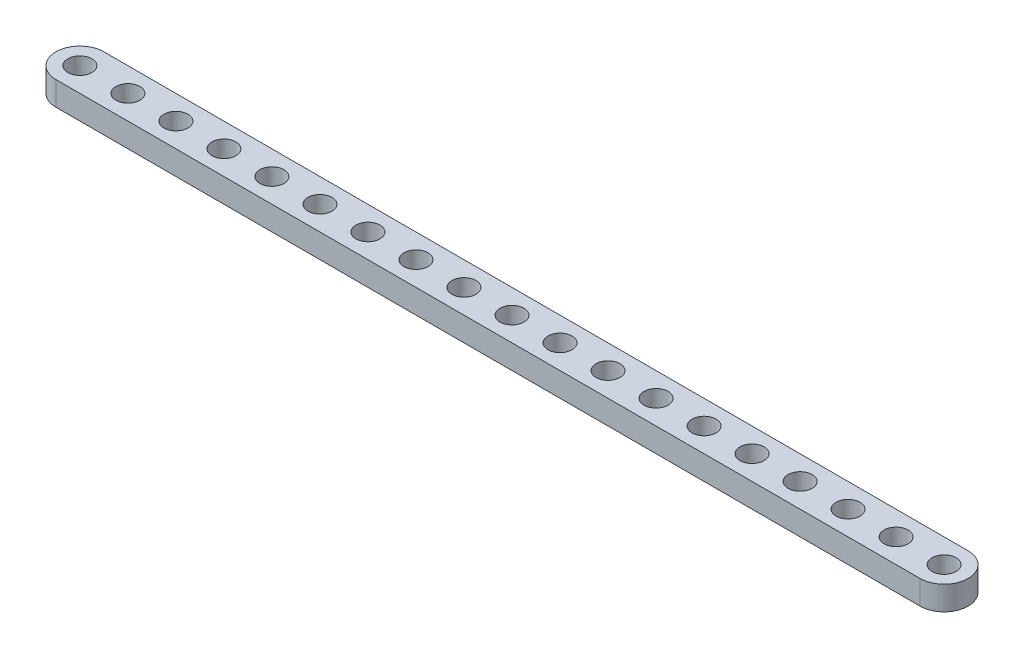
ISO-10303-21;
HEADER;
FILE_DESCRIPTION(('STEP AP214'),'2;1');
FILE_NAME('part.step','',(''),(''),'','','');
FILE_SCHEMA(('AUTOMOTIVE_DESIGN { 1 0 10303 214 1 1 1 1 }'));
ENDSEC;
DATA;
#1=APPLICATION_CONTEXT('core data for automotive mechanical design processes');
#2=APPLICATION_PROTOCOL_DEFINITION('international standard','automotive_design',2000,#1);
#3=PRODUCT_CONTEXT('',#1,'mechanical');
#4=PRODUCT('Part','Part','',(#3));
#5=PRODUCT_RELATED_PRODUCT_CATEGORY('part','',(#4));
#6=PRODUCT_DEFINITION_FORMATION('','',#4);
#7=PRODUCT_DEFINITION_CONTEXT('part definition',#1,'design');
#8=PRODUCT_DEFINITION('design','',#6,#7);
#9=PRODUCT_DEFINITION_SHAPE('','',#8);
#10=(LENGTH_UNIT() NAMED_UNIT(*) SI_UNIT(.MILLI.,.METRE.));
#11=(NAMED_UNIT(*) PLANE_ANGLE_UNIT() SI_UNIT($,.RADIAN.));
#12=(NAMED_UNIT(*) SI_UNIT($,.STERADIAN.) SOLID_ANGLE_UNIT());
#13=UNCERTAINTY_MEASURE_WITH_UNIT(LENGTH_MEASURE(1.E-05),#10,'distance_accuracy_value','');
#14=(GEOMETRIC_REPRESENTATION_CONTEXT(3) GLOBAL_UNCERTAINTY_ASSIGNED_CONTEXT((#13)) GLOBAL_UNIT_ASSIGNED_CONTEXT((#10,
#11,#12)) REPRESENTATION_CONTEXT('',''));
#15=CARTESIAN_POINT('',(0.,0.,0.));
#16=DIRECTION('',(0.,0.,1.));
#17=DIRECTION('',(1.,0.,0.));
#18=AXIS2_PLACEMENT_3D('',#15,#16,#17);
#19=CARTESIAN_POINT('',(-72.,4.,0.));
#20=DIRECTION('',(0.,-1.,0.));
#21=DIRECTION('',(0.,0.,-1.));
#22=AXIS2_PLACEMENT_3D('',#19,#20,#21);
#23=CYLINDRICAL_SURFACE('',#22,4.);
#24=CARTESIAN_POINT('',(-72.,0.,0.));
#25=DIRECTION('',(0.,-1.,0.));
#26=DIRECTION('',(0.,0.,-1.));
#27=AXIS2_PLACEMENT_3D('',#24,#25,#26);
#28=CIRCLE('',#27,4.);
#29=CARTESIAN_POINT('',(-72.,0.,4.));
#30=VERTEX_POINT('',#29);
#31=CARTESIAN_POINT('',(-72.,0.,-4.));
#32=VERTEX_POINT('',#31);
#33=EDGE_CURVE('E98',#30,#32,#28,.T.);
#34=ORIENTED_EDGE('',*,*,#33,.F.);
#35=DIRECTION('',(0.,-1.,0.));
#36=VECTOR('',#35,1.);
#37=CARTESIAN_POINT('',(-72.,4.,4.));
#38=LINE('',#37,#36);
#39=CARTESIAN_POINT('',(-72.,4.,4.));
#40=VERTEX_POINT('',#39);
#41=EDGE_CURVE('E11',#40,#30,#38,.T.);
#42=ORIENTED_EDGE('',*,*,#41,.F.);
#43=CARTESIAN_POINT('',(-72.,4.,0.));
#44=DIRECTION('',(0.,-1.,0.));
#45=DIRECTION('',(0.,0.,-1.));
#46=AXIS2_PLACEMENT_3D('',#43,#44,#45);
#47=CIRCLE('',#46,4.);
#48=CARTESIAN_POINT('',(-72.,4.,-4.));
#49=VERTEX_POINT('',#48);
#50=EDGE_CURVE('E91',#40,#49,#47,.T.);
#51=ORIENTED_EDGE('',*,*,#50,.T.);
#52=DIRECTION('',(0.,-1.,0.));
#53=VECTOR('',#52,1.);
#54=CARTESIAN_POINT('',(-72.,4.,-4.));
#55=LINE('',#54,#53);
#56=EDGE_CURVE('E36',#49,#32,#55,.T.);
#57=ORIENTED_EDGE('',*,*,#56,.T.);
#58=EDGE_LOOP('',(#34,#42,#51,#57));
#59=FACE_BOUND('',#58,.T.);
#60=ADVANCED_FACE('F33',(#59),#23,.T.);
#61=CARTESIAN_POINT('',(72.,4.,4.));
#62=DIRECTION('',(0.,0.,1.));
#63=DIRECTION('',(1.,0.,0.));
#64=AXIS2_PLACEMENT_3D('',#61,#62,#63);
#65=PLANE('',#64);
#66=DIRECTION('',(-1.,0.,0.));
#67=VECTOR('',#66,1.);
#68=CARTESIAN_POINT('',(72.,0.,4.));
#69=LINE('',#68,#67);
#70=CARTESIAN_POINT('',(72.,0.,4.));
#71=VERTEX_POINT('',#70);
#72=EDGE_CURVE('E93',#71,#30,#69,.T.);
#73=ORIENTED_EDGE('',*,*,#72,.F.);
#74=DIRECTION('',(0.,-1.,0.));
#75=VECTOR('',#74,1.);
#76=CARTESIAN_POINT('',(72.,4.,4.));
#77=LINE('',#76,#75);
#78=CARTESIAN_POINT('',(72.,4.,4.));
#79=VERTEX_POINT('',#78);
#80=EDGE_CURVE('E42',#79,#71,#77,.T.);
#81=ORIENTED_EDGE('',*,*,#80,.F.);
#82=DIRECTION('',(-1.,0.,0.));
#83=VECTOR('',#82,1.);
#84=CARTESIAN_POINT('',(72.,4.,4.));
#85=LINE('',#84,#83);
#86=EDGE_CURVE('E88',#79,#40,#85,.T.);
#87=ORIENTED_EDGE('',*,*,#86,.T.);
#88=ORIENTED_EDGE('',*,*,#41,.T.);
#89=EDGE_LOOP('',(#73,#81,#87,#88));
#90=FACE_BOUND('',#89,.T.);
#91=ADVANCED_FACE('F109',(#90),#65,.T.);
#92=CARTESIAN_POINT('',(72.,4.,0.));
#93=DIRECTION('',(0.,-1.,0.));
#94=DIRECTION('',(0.,0.,-1.));
#95=AXIS2_PLACEMENT_3D('',#92,#93,#94);
#96=CYLINDRICAL_SURFACE('',#95,4.);
#97=CARTESIAN_POINT('',(72.,0.,0.));
#98=DIRECTION('',(0.,-1.,0.));
#99=DIRECTION('',(0.,0.,-1.));
#100=AXIS2_PLACEMENT_3D('',#97,#98,#99);
#101=CIRCLE('',#100,4.);
#102=CARTESIAN_POINT('',(72.,0.,-4.));
#103=VERTEX_POINT('',#102);
#104=EDGE_CURVE('E83',#103,#71,#101,.T.);
#105=ORIENTED_EDGE('',*,*,#104,.F.);
#106=DIRECTION('',(0.,-1.,0.));
#107=VECTOR('',#106,1.);
#108=CARTESIAN_POINT('',(72.,4.,-4.));
#109=LINE('',#108,#107);
#110=CARTESIAN_POINT('',(72.,4.,-4.));
#111=VERTEX_POINT('',#110);
#112=EDGE_CURVE('E78',#111,#103,#109,.T.);
#113=ORIENTED_EDGE('',*,*,#112,.F.);
#114=CARTESIAN_POINT('',(72.,4.,0.));
#115=DIRECTION('',(0.,-1.,0.));
#116=DIRECTION('',(0.,0.,-1.));
#117=AXIS2_PLACEMENT_3D('',#114,#115,#116);
#118=CIRCLE('',#117,4.);
#119=EDGE_CURVE('E81',#111,#79,#118,.T.);
#120=ORIENTED_EDGE('',*,*,#119,.T.);
#121=ORIENTED_EDGE('',*,*,#80,.T.);
#122=EDGE_LOOP('',(#105,#113,#120,#121));
#123=FACE_BOUND('',#122,.T.);
#124=ADVANCED_FACE('F80',(#123),#96,.T.);
#125=CARTESIAN_POINT('',(-72.,4.,-4.));
#126=DIRECTION('',(0.,0.,-1.));
#127=DIRECTION('',(-1.,0.,0.));
#128=AXIS2_PLACEMENT_3D('',#125,#126,#127);
#129=PLANE('',#128);
#130=DIRECTION('',(1.,0.,0.));
#131=VECTOR('',#130,1.);
#132=CARTESIAN_POINT('',(-72.,0.,-4.));
#133=LINE('',#132,#131);
#134=EDGE_CURVE('E101',#32,#103,#133,.T.);
#135=ORIENTED_EDGE('',*,*,#134,.F.);
#136=ORIENTED_EDGE('',*,*,#56,.F.);
#137=DIRECTION('',(1.,0.,0.));
#138=VECTOR('',#137,1.);
#139=CARTESIAN_POINT('',(-72.,4.,-4.));
#140=LINE('',#139,#138);
#141=EDGE_CURVE('E87',#49,#111,#140,.T.);
#142=ORIENTED_EDGE('',*,*,#141,.T.);
#143=ORIENTED_EDGE('',*,*,#112,.T.);
#144=EDGE_LOOP('',(#135,#136,#142,#143));
#145=FACE_BOUND('',#144,.T.);
#146=ADVANCED_FACE('F90',(#145),#129,.T.);
#147=CARTESIAN_POINT('',(-72.,4.,0.));
#148=DIRECTION('',(0.,-1.,0.));
#149=DIRECTION('',(0.,0.,-1.));
#150=AXIS2_PLACEMENT_3D('',#147,#148,#149);
#151=PLANE('',#150);
#152=CARTESIAN_POINT('',(72.,4.,0.));
#153=DIRECTION('',(0.,-1.,0.));
#154=DIRECTION('',(0.,0.,1.));
#155=AXIS2_PLACEMENT_3D('',#152,#153,#154);
#156=CIRCLE('',#155,1.99999999999999);
#157=CARTESIAN_POINT('',(72.,4.,1.99999999999999));
#158=VERTEX_POINT('',#157);
#159=EDGE_CURVE('E210',#158,#158,#156,.T.);
#160=ORIENTED_EDGE('',*,*,#159,.T.);
#161=EDGE_LOOP('',(#160));
#162=FACE_BOUND('',#161,.T.);
#163=CARTESIAN_POINT('',(64.,4.,0.));
#164=DIRECTION('',(0.,-1.,0.));
#165=DIRECTION('',(0.,0.,1.));
#166=AXIS2_PLACEMENT_3D('',#163,#164,#165);
#167=CIRCLE('',#166,1.99999999999999);
#168=CARTESIAN_POINT('',(64.,4.,1.99999999999999));
#169=VERTEX_POINT('',#168);
#170=EDGE_CURVE('E218',#169,#169,#167,.T.);
#171=ORIENTED_EDGE('',*,*,#170,.T.);
#172=EDGE_LOOP('',(#171));
#173=FACE_BOUND('',#172,.T.);
#174=CARTESIAN_POINT('',(56.,4.,0.));
#175=DIRECTION('',(0.,-1.,0.));
#176=DIRECTION('',(0.,0.,1.));
#177=AXIS2_PLACEMENT_3D('',#174,#175,#176);
#178=CIRCLE('',#177,1.99999999999999);
#179=CARTESIAN_POINT('',(56.,4.,1.99999999999999));
#180=VERTEX_POINT('',#179);
#181=EDGE_CURVE('E224',#180,#180,#178,.T.);
#182=ORIENTED_EDGE('',*,*,#181,.T.);
#183=EDGE_LOOP('',(#182));
#184=FACE_BOUND('',#183,.T.);
#185=CARTESIAN_POINT('',(48.,4.,0.));
#186=DIRECTION('',(0.,-1.,0.));
#187=DIRECTION('',(0.,0.,1.));
#188=AXIS2_PLACEMENT_3D('',#185,#186,#187);
#189=CIRCLE('',#188,1.99999999999999);
#190=CARTESIAN_POINT('',(48.,4.,1.99999999999999));
#191=VERTEX_POINT('',#190);
#192=EDGE_CURVE('E230',#191,#191,#189,.T.);
#193=ORIENTED_EDGE('',*,*,#192,.T.);
#194=EDGE_LOOP('',(#193));
#195=FACE_BOUND('',#194,.T.);
#196=CARTESIAN_POINT('',(40.,4.,0.));
#197=DIRECTION('',(0.,-1.,0.));
#198=DIRECTION('',(0.,0.,1.));
#199=AXIS2_PLACEMENT_3D('',#196,#197,#198);
#200=CIRCLE('',#199,1.99999999999999);
#201=CARTESIAN_POINT('',(40.,4.,1.99999999999999));
#202=VERTEX_POINT('',#201);
#203=EDGE_CURVE('E236',#202,#202,#200,.T.);
#204=ORIENTED_EDGE('',*,*,#203,.T.);
#205=EDGE_LOOP('',(#204));
#206=FACE_BOUND('',#205,.T.);
#207=CARTESIAN_POINT('',(32.,4.,0.));
#208=DIRECTION('',(0.,-1.,0.));
#209=DIRECTION('',(0.,0.,1.));
#210=AXIS2_PLACEMENT_3D('',#207,#208,#209);
#211=CIRCLE('',#210,1.99999999999999);
#212=CARTESIAN_POINT('',(32.,4.,1.99999999999999));
#213=VERTEX_POINT('',#212);
#214=EDGE_CURVE('E242',#213,#213,#211,.T.);
#215=ORIENTED_EDGE('',*,*,#214,.T.);
#216=EDGE_LOOP('',(#215));
#217=FACE_BOUND('',#216,.T.);
#218=CARTESIAN_POINT('',(24.,4.,0.));
#219=DIRECTION('',(0.,-1.,0.));
#220=DIRECTION('',(0.,0.,1.));
#221=AXIS2_PLACEMENT_3D('',#218,#219,#220);
#222=CIRCLE('',#221,1.99999999999999);
#223=CARTESIAN_POINT('',(24.,4.,1.99999999999999));
#224=VERTEX_POINT('',#223);
#225=EDGE_CURVE('E248',#224,#224,#222,.T.);
#226=ORIENTED_EDGE('',*,*,#225,.T.);
#227=EDGE_LOOP('',(#226));
#228=FACE_BOUND('',#227,.T.);
#229=CARTESIAN_POINT('',(16.,4.,0.));
#230=DIRECTION('',(0.,-1.,0.));
#231=DIRECTION('',(0.,0.,1.));
#232=AXIS2_PLACEMENT_3D('',#229,#230,#231);
#233=CIRCLE('',#232,1.99999999999999);
#234=CARTESIAN_POINT('',(16.,4.,1.99999999999999));
#235=VERTEX_POINT('',#234);
#236=EDGE_CURVE('E254',#235,#235,#233,.T.);
#237=ORIENTED_EDGE('',*,*,#236,.T.);
#238=EDGE_LOOP('',(#237));
#239=FACE_BOUND('',#238,.T.);
#240=CARTESIAN_POINT('',(8.00000000000001,4.,0.));
#241=DIRECTION('',(0.,-1.,0.));
#242=DIRECTION('',(0.,0.,1.));
#243=AXIS2_PLACEMENT_3D('',#240,#241,#242);
#244=CIRCLE('',#243,1.99999999999999);
#245=CARTESIAN_POINT('',(8.00000000000001,4.,1.99999999999999));
#246=VERTEX_POINT('',#245);
#247=EDGE_CURVE('E260',#246,#246,#244,.T.);
#248=ORIENTED_EDGE('',*,*,#247,.T.);
#249=EDGE_LOOP('',(#248));
#250=FACE_BOUND('',#249,.T.);
#251=CARTESIAN_POINT('',(0.,4.,0.));
#252=DIRECTION('',(0.,-1.,0.));
#253=DIRECTION('',(0.,0.,1.));
#254=AXIS2_PLACEMENT_3D('',#251,#252,#253);
#255=CIRCLE('',#254,1.99999999999999);
#256=CARTESIAN_POINT('',(0.,4.,1.99999999999999));
#257=VERTEX_POINT('',#256);
#258=EDGE_CURVE('E266',#257,#257,#255,.T.);
#259=ORIENTED_EDGE('',*,*,#258,.T.);
#260=EDGE_LOOP('',(#259));
#261=FACE_BOUND('',#260,.T.);
#262=CARTESIAN_POINT('',(-7.99999999999999,4.,0.));
#263=DIRECTION('',(0.,-1.,0.));
#264=DIRECTION('',(0.,0.,1.));
#265=AXIS2_PLACEMENT_3D('',#262,#263,#264);
#266=CIRCLE('',#265,1.99999999999999);
#267=CARTESIAN_POINT('',(-7.99999999999999,4.,1.99999999999999));
#268=VERTEX_POINT('',#267);
#269=EDGE_CURVE('E272',#268,#268,#266,.T.);
#270=ORIENTED_EDGE('',*,*,#269,.T.);
#271=EDGE_LOOP('',(#270));
#272=FACE_BOUND('',#271,.T.);
#273=CARTESIAN_POINT('',(-16.,4.,0.));
#274=DIRECTION('',(0.,-1.,0.));
#275=DIRECTION('',(0.,0.,1.));
#276=AXIS2_PLACEMENT_3D('',#273,#274,#275);
#277=CIRCLE('',#276,1.99999999999999);
#278=CARTESIAN_POINT('',(-16.,4.,1.99999999999999));
#279=VERTEX_POINT('',#278);
#280=EDGE_CURVE('E278',#279,#279,#277,.T.);
#281=ORIENTED_EDGE('',*,*,#280,.T.);
#282=EDGE_LOOP('',(#281));
#283=FACE_BOUND('',#282,.T.);
#284=CARTESIAN_POINT('',(-24.,4.,0.));
#285=DIRECTION('',(0.,-1.,0.));
#286=DIRECTION('',(0.,0.,1.));
#287=AXIS2_PLACEMENT_3D('',#284,#285,#286);
#288=CIRCLE('',#287,1.99999999999999);
#289=CARTESIAN_POINT('',(-24.,4.,1.99999999999999));
#290=VERTEX_POINT('',#289);
#291=EDGE_CURVE('E284',#290,#290,#288,.T.);
#292=ORIENTED_EDGE('',*,*,#291,.T.);
#293=EDGE_LOOP('',(#292));
#294=FACE_BOUND('',#293,.T.);
#295=CARTESIAN_POINT('',(-32.,4.,0.));
#296=DIRECTION('',(0.,-1.,0.));
#297=DIRECTION('',(0.,0.,1.));
#298=AXIS2_PLACEMENT_3D('',#295,#296,#297);
#299=CIRCLE('',#298,1.99999999999999);
#300=CARTESIAN_POINT('',(-32.,4.,1.99999999999999));
#301=VERTEX_POINT('',#300);
#302=EDGE_CURVE('E290',#301,#301,#299,.T.);
#303=ORIENTED_EDGE('',*,*,#302,.T.);
#304=EDGE_LOOP('',(#303));
#305=FACE_BOUND('',#304,.T.);
#306=CARTESIAN_POINT('',(-40.,4.,0.));
#307=DIRECTION('',(0.,-1.,0.));
#308=DIRECTION('',(0.,0.,1.));
#309=AXIS2_PLACEMENT_3D('',#306,#307,#308);
#310=CIRCLE('',#309,1.99999999999999);
#311=CARTESIAN_POINT('',(-40.,4.,1.99999999999999));
#312=VERTEX_POINT('',#311);
#313=EDGE_CURVE('E296',#312,#312,#310,.T.);
#314=ORIENTED_EDGE('',*,*,#313,.T.);
#315=EDGE_LOOP('',(#314));
#316=FACE_BOUND('',#315,.T.);
#317=CARTESIAN_POINT('',(-48.,4.,0.));
#318=DIRECTION('',(0.,-1.,0.));
#319=DIRECTION('',(0.,0.,1.));
#320=AXIS2_PLACEMENT_3D('',#317,#318,#319);
#321=CIRCLE('',#320,1.99999999999999);
#322=CARTESIAN_POINT('',(-48.,4.,1.99999999999999));
#323=VERTEX_POINT('',#322);
#324=EDGE_CURVE('E302',#323,#323,#321,.T.);
#325=ORIENTED_EDGE('',*,*,#324,.T.);
#326=EDGE_LOOP('',(#325));
#327=FACE_BOUND('',#326,.T.);
#328=CARTESIAN_POINT('',(-56.,4.,0.));
#329=DIRECTION('',(0.,-1.,0.));
#330=DIRECTION('',(0.,0.,1.));
#331=AXIS2_PLACEMENT_3D('',#328,#329,#330);
#332=CIRCLE('',#331,1.99999999999999);
#333=CARTESIAN_POINT('',(-56.,4.,1.99999999999999));
#334=VERTEX_POINT('',#333);
#335=EDGE_CURVE('E308',#334,#334,#332,.T.);
#336=ORIENTED_EDGE('',*,*,#335,.T.);
#337=EDGE_LOOP('',(#336));
#338=FACE_BOUND('',#337,.T.);
#339=CARTESIAN_POINT('',(-64.,4.,0.));
#340=DIRECTION('',(0.,-1.,0.));
#341=DIRECTION('',(0.,0.,1.));
#342=AXIS2_PLACEMENT_3D('',#339,#340,#341);
#343=CIRCLE('',#342,1.99999999999999);
#344=CARTESIAN_POINT('',(-64.,4.,1.99999999999999));
#345=VERTEX_POINT('',#344);
#346=EDGE_CURVE('E314',#345,#345,#343,.T.);
#347=ORIENTED_EDGE('',*,*,#346,.T.);
#348=EDGE_LOOP('',(#347));
#349=FACE_BOUND('',#348,.T.);
#350=CARTESIAN_POINT('',(-72.,4.,0.));
#351=DIRECTION('',(0.,-1.,0.));
#352=DIRECTION('',(0.,0.,1.));
#353=AXIS2_PLACEMENT_3D('',#350,#351,#352);
#354=CIRCLE('',#353,1.99999999999999);
#355=CARTESIAN_POINT('',(-72.,4.,1.99999999999999));
#356=VERTEX_POINT('',#355);
#357=EDGE_CURVE('E102',#356,#356,#354,.T.);
#358=ORIENTED_EDGE('',*,*,#357,.T.);
#359=EDGE_LOOP('',(#358));
#360=FACE_BOUND('',#359,.T.);
#361=ORIENTED_EDGE('',*,*,#50,.F.);
#362=ORIENTED_EDGE('',*,*,#86,.F.);
#363=ORIENTED_EDGE('',*,*,#119,.F.);
#364=ORIENTED_EDGE('',*,*,#141,.F.);
#365=EDGE_LOOP('',(#361,#362,#363,#364));
#366=FACE_BOUND('',#365,.T.);
#367=ADVANCED_FACE('F86',(#162,#173,#184,#195,#206,#217,#228,#239,#250,#261,#272,#283,#294,#305,
#316,#327,#338,#349,#360,#366),#151,.F.);
#368=CARTESIAN_POINT('',(-72.,0.,0.));
#369=DIRECTION('',(0.,-1.,0.));
#370=DIRECTION('',(0.,0.,-1.));
#371=AXIS2_PLACEMENT_3D('',#368,#369,#370);
#372=PLANE('',#371);
#373=CARTESIAN_POINT('',(72.,0.,0.));
#374=DIRECTION('',(0.,-1.,0.));
#375=DIRECTION('',(0.,0.,1.));
#376=AXIS2_PLACEMENT_3D('',#373,#374,#375);
#377=CIRCLE('',#376,1.99999999999999);
#378=CARTESIAN_POINT('',(72.,0.,1.99999999999999));
#379=VERTEX_POINT('',#378);
#380=EDGE_CURVE('E213',#379,#379,#377,.T.);
#381=ORIENTED_EDGE('',*,*,#380,.F.);
#382=EDGE_LOOP('',(#381));
#383=FACE_BOUND('',#382,.T.);
#384=CARTESIAN_POINT('',(64.,0.,0.));
#385=DIRECTION('',(0.,-1.,0.));
#386=DIRECTION('',(0.,0.,1.));
#387=AXIS2_PLACEMENT_3D('',#384,#385,#386);
#388=CIRCLE('',#387,1.99999999999999);
#389=CARTESIAN_POINT('',(64.,0.,1.99999999999999));
#390=VERTEX_POINT('',#389);
#391=EDGE_CURVE('E215',#390,#390,#388,.T.);
#392=ORIENTED_EDGE('',*,*,#391,.F.);
#393=EDGE_LOOP('',(#392));
#394=FACE_BOUND('',#393,.T.);
#395=CARTESIAN_POINT('',(56.,0.,0.));
#396=DIRECTION('',(0.,-1.,0.));
#397=DIRECTION('',(0.,0.,1.));
#398=AXIS2_PLACEMENT_3D('',#395,#396,#397);
#399=CIRCLE('',#398,1.99999999999999);
#400=CARTESIAN_POINT('',(56.,0.,1.99999999999999));
#401=VERTEX_POINT('',#400);
#402=EDGE_CURVE('E221',#401,#401,#399,.T.);
#403=ORIENTED_EDGE('',*,*,#402,.F.);
#404=EDGE_LOOP('',(#403));
#405=FACE_BOUND('',#404,.T.);
#406=CARTESIAN_POINT('',(48.,0.,0.));
#407=DIRECTION('',(0.,-1.,0.));
#408=DIRECTION('',(0.,0.,1.));
#409=AXIS2_PLACEMENT_3D('',#406,#407,#408);
#410=CIRCLE('',#409,1.99999999999999);
#411=CARTESIAN_POINT('',(48.,0.,1.99999999999999));
#412=VERTEX_POINT('',#411);
#413=EDGE_CURVE('E227',#412,#412,#410,.T.);
#414=ORIENTED_EDGE('',*,*,#413,.F.);
#415=EDGE_LOOP('',(#414));
#416=FACE_BOUND('',#415,.T.);
#417=CARTESIAN_POINT('',(40.,0.,0.));
#418=DIRECTION('',(0.,-1.,0.));
#419=DIRECTION('',(0.,0.,1.));
#420=AXIS2_PLACEMENT_3D('',#417,#418,#419);
#421=CIRCLE('',#420,1.99999999999999);
#422=CARTESIAN_POINT('',(40.,0.,1.99999999999999));
#423=VERTEX_POINT('',#422);
#424=EDGE_CURVE('E233',#423,#423,#421,.T.);
#425=ORIENTED_EDGE('',*,*,#424,.F.);
#426=EDGE_LOOP('',(#425));
#427=FACE_BOUND('',#426,.T.);
#428=CARTESIAN_POINT('',(32.,0.,0.));
#429=DIRECTION('',(0.,-1.,0.));
#430=DIRECTION('',(0.,0.,1.));
#431=AXIS2_PLACEMENT_3D('',#428,#429,#430);
#432=CIRCLE('',#431,1.99999999999999);
#433=CARTESIAN_POINT('',(32.,0.,1.99999999999999));
#434=VERTEX_POINT('',#433);
#435=EDGE_CURVE('E239',#434,#434,#432,.T.);
#436=ORIENTED_EDGE('',*,*,#435,.F.);
#437=EDGE_LOOP('',(#436));
#438=FACE_BOUND('',#437,.T.);
#439=CARTESIAN_POINT('',(24.,0.,0.));
#440=DIRECTION('',(0.,-1.,0.));
#441=DIRECTION('',(0.,0.,1.));
#442=AXIS2_PLACEMENT_3D('',#439,#440,#441);
#443=CIRCLE('',#442,1.99999999999999);
#444=CARTESIAN_POINT('',(24.,0.,1.99999999999999));
#445=VERTEX_POINT('',#444);
#446=EDGE_CURVE('E245',#445,#445,#443,.T.);
#447=ORIENTED_EDGE('',*,*,#446,.F.);
#448=EDGE_LOOP('',(#447));
#449=FACE_BOUND('',#448,.T.);
#450=CARTESIAN_POINT('',(16.,0.,0.));
#451=DIRECTION('',(0.,-1.,0.));
#452=DIRECTION('',(0.,0.,1.));
#453=AXIS2_PLACEMENT_3D('',#450,#451,#452);
#454=CIRCLE('',#453,1.99999999999999);
#455=CARTESIAN_POINT('',(16.,0.,1.99999999999999));
#456=VERTEX_POINT('',#455);
#457=EDGE_CURVE('E251',#456,#456,#454,.T.);
#458=ORIENTED_EDGE('',*,*,#457,.F.);
#459=EDGE_LOOP('',(#458));
#460=FACE_BOUND('',#459,.T.);
#461=CARTESIAN_POINT('',(8.00000000000001,0.,0.));
#462=DIRECTION('',(0.,-1.,0.));
#463=DIRECTION('',(0.,0.,1.));
#464=AXIS2_PLACEMENT_3D('',#461,#462,#463);
#465=CIRCLE('',#464,1.99999999999999);
#466=CARTESIAN_POINT('',(8.00000000000001,0.,1.99999999999999));
#467=VERTEX_POINT('',#466);
#468=EDGE_CURVE('E257',#467,#467,#465,.T.);
#469=ORIENTED_EDGE('',*,*,#468,.F.);
#470=EDGE_LOOP('',(#469));
#471=FACE_BOUND('',#470,.T.);
#472=CARTESIAN_POINT('',(0.,0.,0.));
#473=DIRECTION('',(0.,-1.,0.));
#474=DIRECTION('',(0.,0.,1.));
#475=AXIS2_PLACEMENT_3D('',#472,#473,#474);
#476=CIRCLE('',#475,1.99999999999999);
#477=CARTESIAN_POINT('',(0.,0.,1.99999999999999));
#478=VERTEX_POINT('',#477);
#479=EDGE_CURVE('E263',#478,#478,#476,.T.);
#480=ORIENTED_EDGE('',*,*,#479,.F.);
#481=EDGE_LOOP('',(#480));
#482=FACE_BOUND('',#481,.T.);
#483=CARTESIAN_POINT('',(-7.99999999999999,0.,0.));
#484=DIRECTION('',(0.,-1.,0.));
#485=DIRECTION('',(0.,0.,1.));
#486=AXIS2_PLACEMENT_3D('',#483,#484,#485);
#487=CIRCLE('',#486,1.99999999999999);
#488=CARTESIAN_POINT('',(-7.99999999999999,0.,1.99999999999999));
#489=VERTEX_POINT('',#488);
#490=EDGE_CURVE('E269',#489,#489,#487,.T.);
#491=ORIENTED_EDGE('',*,*,#490,.F.);
#492=EDGE_LOOP('',(#491));
#493=FACE_BOUND('',#492,.T.);
#494=CARTESIAN_POINT('',(-16.,0.,0.));
#495=DIRECTION('',(0.,-1.,0.));
#496=DIRECTION('',(0.,0.,1.));
#497=AXIS2_PLACEMENT_3D('',#494,#495,#496);
#498=CIRCLE('',#497,1.99999999999999);
#499=CARTESIAN_POINT('',(-16.,0.,1.99999999999999));
#500=VERTEX_POINT('',#499);
#501=EDGE_CURVE('E275',#500,#500,#498,.T.);
#502=ORIENTED_EDGE('',*,*,#501,.F.);
#503=EDGE_LOOP('',(#502));
#504=FACE_BOUND('',#503,.T.);
#505=CARTESIAN_POINT('',(-24.,0.,0.));
#506=DIRECTION('',(0.,-1.,0.));
#507=DIRECTION('',(0.,0.,1.));
#508=AXIS2_PLACEMENT_3D('',#505,#506,#507);
#509=CIRCLE('',#508,1.99999999999999);
#510=CARTESIAN_POINT('',(-24.,0.,1.99999999999999));
#511=VERTEX_POINT('',#510);
#512=EDGE_CURVE('E281',#511,#511,#509,.T.);
#513=ORIENTED_EDGE('',*,*,#512,.F.);
#514=EDGE_LOOP('',(#513));
#515=FACE_BOUND('',#514,.T.);
#516=CARTESIAN_POINT('',(-32.,0.,0.));
#517=DIRECTION('',(0.,-1.,0.));
#518=DIRECTION('',(0.,0.,1.));
#519=AXIS2_PLACEMENT_3D('',#516,#517,#518);
#520=CIRCLE('',#519,1.99999999999999);
#521=CARTESIAN_POINT('',(-32.,0.,1.99999999999999));
#522=VERTEX_POINT('',#521);
#523=EDGE_CURVE('E287',#522,#522,#520,.T.);
#524=ORIENTED_EDGE('',*,*,#523,.F.);
#525=EDGE_LOOP('',(#524));
#526=FACE_BOUND('',#525,.T.);
#527=CARTESIAN_POINT('',(-40.,0.,0.));
#528=DIRECTION('',(0.,-1.,0.));
#529=DIRECTION('',(0.,0.,1.));
#530=AXIS2_PLACEMENT_3D('',#527,#528,#529);
#531=CIRCLE('',#530,1.99999999999999);
#532=CARTESIAN_POINT('',(-40.,0.,1.99999999999999));
#533=VERTEX_POINT('',#532);
#534=EDGE_CURVE('E293',#533,#533,#531,.T.);
#535=ORIENTED_EDGE('',*,*,#534,.F.);
#536=EDGE_LOOP('',(#535));
#537=FACE_BOUND('',#536,.T.);
#538=CARTESIAN_POINT('',(-48.,0.,0.));
#539=DIRECTION('',(0.,-1.,0.));
#540=DIRECTION('',(0.,0.,1.));
#541=AXIS2_PLACEMENT_3D('',#538,#539,#540);
#542=CIRCLE('',#541,1.99999999999999);
#543=CARTESIAN_POINT('',(-48.,0.,1.99999999999999));
#544=VERTEX_POINT('',#543);
#545=EDGE_CURVE('E299',#544,#544,#542,.T.);
#546=ORIENTED_EDGE('',*,*,#545,.F.);
#547=EDGE_LOOP('',(#546));
#548=FACE_BOUND('',#547,.T.);
#549=CARTESIAN_POINT('',(-56.,0.,0.));
#550=DIRECTION('',(0.,-1.,0.));
#551=DIRECTION('',(0.,0.,1.));
#552=AXIS2_PLACEMENT_3D('',#549,#550,#551);
#553=CIRCLE('',#552,1.99999999999999);
#554=CARTESIAN_POINT('',(-56.,0.,1.99999999999999));
#555=VERTEX_POINT('',#554);
#556=EDGE_CURVE('E305',#555,#555,#553,.T.);
#557=ORIENTED_EDGE('',*,*,#556,.F.);
#558=EDGE_LOOP('',(#557));
#559=FACE_BOUND('',#558,.T.);
#560=CARTESIAN_POINT('',(-64.,0.,0.));
#561=DIRECTION('',(0.,-1.,0.));
#562=DIRECTION('',(0.,0.,1.));
#563=AXIS2_PLACEMENT_3D('',#560,#561,#562);
#564=CIRCLE('',#563,1.99999999999999);
#565=CARTESIAN_POINT('',(-64.,0.,1.99999999999999));
#566=VERTEX_POINT('',#565);
#567=EDGE_CURVE('E311',#566,#566,#564,.T.);
#568=ORIENTED_EDGE('',*,*,#567,.F.);
#569=EDGE_LOOP('',(#568));
#570=FACE_BOUND('',#569,.T.);
#571=CARTESIAN_POINT('',(-72.,0.,0.));
#572=DIRECTION('',(0.,-1.,0.));
#573=DIRECTION('',(0.,0.,1.));
#574=AXIS2_PLACEMENT_3D('',#571,#572,#573);
#575=CIRCLE('',#574,1.99999999999999);
#576=CARTESIAN_POINT('',(-72.,0.,1.99999999999999));
#577=VERTEX_POINT('',#576);
#578=EDGE_CURVE('E317',#577,#577,#575,.T.);
#579=ORIENTED_EDGE('',*,*,#578,.F.);
#580=EDGE_LOOP('',(#579));
#581=FACE_BOUND('',#580,.T.);
#582=ORIENTED_EDGE('',*,*,#33,.T.);
#583=ORIENTED_EDGE('',*,*,#134,.T.);
#584=ORIENTED_EDGE('',*,*,#104,.T.);
#585=ORIENTED_EDGE('',*,*,#72,.T.);
#586=EDGE_LOOP('',(#582,#583,#584,#585));
#587=FACE_BOUND('',#586,.T.);
#588=ADVANCED_FACE('F108',(#383,#394,#405,#416,#427,#438,#449,#460,#471,#482,#493,#504,#515,
#526,#537,#548,#559,#570,#581,#587),#372,.T.);
#589=CARTESIAN_POINT('',(-72.,4.,0.));
#590=DIRECTION('',(0.,-1.,0.));
#591=DIRECTION('',(0.,0.,-1.));
#592=AXIS2_PLACEMENT_3D('',#589,#590,#591);
#593=CYLINDRICAL_SURFACE('',#592,1.99999999999999);
#594=ORIENTED_EDGE('',*,*,#357,.F.);
#595=EDGE_LOOP('',(#594));
#596=FACE_BOUND('',#595,.T.);
#597=ORIENTED_EDGE('',*,*,#578,.T.);
#598=EDGE_LOOP('',(#597));
#599=FACE_BOUND('',#598,.T.);
#600=ADVANCED_FACE('F127',(#596,#599),#593,.F.);
#601=CARTESIAN_POINT('',(-64.,4.,0.));
#602=DIRECTION('',(0.,-1.,0.));
#603=DIRECTION('',(0.,0.,-1.));
#604=AXIS2_PLACEMENT_3D('',#601,#602,#603);
#605=CYLINDRICAL_SURFACE('',#604,1.99999999999999);
#606=ORIENTED_EDGE('',*,*,#346,.F.);
#607=EDGE_LOOP('',(#606));
#608=FACE_BOUND('',#607,.T.);
#609=ORIENTED_EDGE('',*,*,#567,.T.);
#610=EDGE_LOOP('',(#609));
#611=FACE_BOUND('',#610,.T.);
#612=ADVANCED_FACE('F134',(#608,#611),#605,.F.);
#613=CARTESIAN_POINT('',(-56.,4.,0.));
#614=DIRECTION('',(0.,-1.,0.));
#615=DIRECTION('',(0.,0.,-1.));
#616=AXIS2_PLACEMENT_3D('',#613,#614,#615);
#617=CYLINDRICAL_SURFACE('',#616,1.99999999999999);
#618=ORIENTED_EDGE('',*,*,#335,.F.);
#619=EDGE_LOOP('',(#618));
#620=FACE_BOUND('',#619,.T.);
#621=ORIENTED_EDGE('',*,*,#556,.T.);
#622=EDGE_LOOP('',(#621));
#623=FACE_BOUND('',#622,.T.);
#624=ADVANCED_FACE('F138',(#620,#623),#617,.F.);
#625=CARTESIAN_POINT('',(-48.,4.,0.));
#626=DIRECTION('',(0.,-1.,0.));
#627=DIRECTION('',(0.,0.,-1.));
#628=AXIS2_PLACEMENT_3D('',#625,#626,#627);
#629=CYLINDRICAL_SURFACE('',#628,1.99999999999999);
#630=ORIENTED_EDGE('',*,*,#324,.F.);
#631=EDGE_LOOP('',(#630));
#632=FACE_BOUND('',#631,.T.);
#633=ORIENTED_EDGE('',*,*,#545,.T.);
#634=EDGE_LOOP('',(#633));
#635=FACE_BOUND('',#634,.T.);
#636=ADVANCED_FACE('F142',(#632,#635),#629,.F.);
#637=CARTESIAN_POINT('',(-40.,4.,0.));
#638=DIRECTION('',(0.,-1.,0.));
#639=DIRECTION('',(0.,0.,-1.));
#640=AXIS2_PLACEMENT_3D('',#637,#638,#639);
#641=CYLINDRICAL_SURFACE('',#640,1.99999999999999);
#642=ORIENTED_EDGE('',*,*,#313,.F.);
#643=EDGE_LOOP('',(#642));
#644=FACE_BOUND('',#643,.T.);
#645=ORIENTED_EDGE('',*,*,#534,.T.);
#646=EDGE_LOOP('',(#645));
#647=FACE_BOUND('',#646,.T.);
#648=ADVANCED_FACE('F146',(#644,#647),#641,.F.);
#649=CARTESIAN_POINT('',(-32.,4.,0.));
#650=DIRECTION('',(0.,-1.,0.));
#651=DIRECTION('',(0.,0.,-1.));
#652=AXIS2_PLACEMENT_3D('',#649,#650,#651);
#653=CYLINDRICAL_SURFACE('',#652,1.99999999999999);
#654=ORIENTED_EDGE('',*,*,#302,.F.);
#655=EDGE_LOOP('',(#654));
#656=FACE_BOUND('',#655,.T.);
#657=ORIENTED_EDGE('',*,*,#523,.T.);
#658=EDGE_LOOP('',(#657));
#659=FACE_BOUND('',#658,.T.);
#660=ADVANCED_FACE('F150',(#656,#659),#653,.F.);
#661=CARTESIAN_POINT('',(-24.,4.,0.));
#662=DIRECTION('',(0.,-1.,0.));
#663=DIRECTION('',(0.,0.,-1.));
#664=AXIS2_PLACEMENT_3D('',#661,#662,#663);
#665=CYLINDRICAL_SURFACE('',#664,1.99999999999999);
#666=ORIENTED_EDGE('',*,*,#291,.F.);
#667=EDGE_LOOP('',(#666));
#668=FACE_BOUND('',#667,.T.);
#669=ORIENTED_EDGE('',*,*,#512,.T.);
#670=EDGE_LOOP('',(#669));
#671=FACE_BOUND('',#670,.T.);
#672=ADVANCED_FACE('F154',(#668,#671),#665,.F.);
#673=CARTESIAN_POINT('',(-16.,4.,0.));
#674=DIRECTION('',(0.,-1.,0.));
#675=DIRECTION('',(0.,0.,-1.));
#676=AXIS2_PLACEMENT_3D('',#673,#674,#675);
#677=CYLINDRICAL_SURFACE('',#676,1.99999999999999);
#678=ORIENTED_EDGE('',*,*,#280,.F.);
#679=EDGE_LOOP('',(#678));
#680=FACE_BOUND('',#679,.T.);
#681=ORIENTED_EDGE('',*,*,#501,.T.);
#682=EDGE_LOOP('',(#681));
#683=FACE_BOUND('',#682,.T.);
#684=ADVANCED_FACE('F158',(#680,#683),#677,.F.);
#685=CARTESIAN_POINT('',(-7.99999999999999,4.,0.));
#686=DIRECTION('',(0.,-1.,0.));
#687=DIRECTION('',(0.,0.,-1.));
#688=AXIS2_PLACEMENT_3D('',#685,#686,#687);
#689=CYLINDRICAL_SURFACE('',#688,1.99999999999999);
#690=ORIENTED_EDGE('',*,*,#269,.F.);
#691=EDGE_LOOP('',(#690));
#692=FACE_BOUND('',#691,.T.);
#693=ORIENTED_EDGE('',*,*,#490,.T.);
#694=EDGE_LOOP('',(#693));
#695=FACE_BOUND('',#694,.T.);
#696=ADVANCED_FACE('F162',(#692,#695),#689,.F.);
#697=CARTESIAN_POINT('',(0.,4.,0.));
#698=DIRECTION('',(0.,-1.,0.));
#699=DIRECTION('',(0.,0.,-1.));
#700=AXIS2_PLACEMENT_3D('',#697,#698,#699);
#701=CYLINDRICAL_SURFACE('',#700,1.99999999999999);
#702=ORIENTED_EDGE('',*,*,#258,.F.);
#703=EDGE_LOOP('',(#702));
#704=FACE_BOUND('',#703,.T.);
#705=ORIENTED_EDGE('',*,*,#479,.T.);
#706=EDGE_LOOP('',(#705));
#707=FACE_BOUND('',#706,.T.);
#708=ADVANCED_FACE('F166',(#704,#707),#701,.F.);
#709=CARTESIAN_POINT('',(8.00000000000001,4.,0.));
#710=DIRECTION('',(0.,-1.,0.));
#711=DIRECTION('',(0.,0.,-1.));
#712=AXIS2_PLACEMENT_3D('',#709,#710,#711);
#713=CYLINDRICAL_SURFACE('',#712,1.99999999999999);
#714=ORIENTED_EDGE('',*,*,#247,.F.);
#715=EDGE_LOOP('',(#714));
#716=FACE_BOUND('',#715,.T.);
#717=ORIENTED_EDGE('',*,*,#468,.T.);
#718=EDGE_LOOP('',(#717));
#719=FACE_BOUND('',#718,.T.);
#720=ADVANCED_FACE('F170',(#716,#719),#713,.F.);
#721=CARTESIAN_POINT('',(16.,4.,0.));
#722=DIRECTION('',(0.,-1.,0.));
#723=DIRECTION('',(0.,0.,-1.));
#724=AXIS2_PLACEMENT_3D('',#721,#722,#723);
#725=CYLINDRICAL_SURFACE('',#724,1.99999999999999);
#726=ORIENTED_EDGE('',*,*,#236,.F.);
#727=EDGE_LOOP('',(#726));
#728=FACE_BOUND('',#727,.T.);
#729=ORIENTED_EDGE('',*,*,#457,.T.);
#730=EDGE_LOOP('',(#729));
#731=FACE_BOUND('',#730,.T.);
#732=ADVANCED_FACE('F174',(#728,#731),#725,.F.);
#733=CARTESIAN_POINT('',(24.,4.,0.));
#734=DIRECTION('',(0.,-1.,0.));
#735=DIRECTION('',(0.,0.,-1.));
#736=AXIS2_PLACEMENT_3D('',#733,#734,#735);
#737=CYLINDRICAL_SURFACE('',#736,1.99999999999999);
#738=ORIENTED_EDGE('',*,*,#225,.F.);
#739=EDGE_LOOP('',(#738));
#740=FACE_BOUND('',#739,.T.);
#741=ORIENTED_EDGE('',*,*,#446,.T.);
#742=EDGE_LOOP('',(#741));
#743=FACE_BOUND('',#742,.T.);
#744=ADVANCED_FACE('F178',(#740,#743),#737,.F.);
#745=CARTESIAN_POINT('',(32.,4.,0.));
#746=DIRECTION('',(0.,-1.,0.));
#747=DIRECTION('',(0.,0.,-1.));
#748=AXIS2_PLACEMENT_3D('',#745,#746,#747);
#749=CYLINDRICAL_SURFACE('',#748,1.99999999999999);
#750=ORIENTED_EDGE('',*,*,#214,.F.);
#751=EDGE_LOOP('',(#750));
#752=FACE_BOUND('',#751,.T.);
#753=ORIENTED_EDGE('',*,*,#435,.T.);
#754=EDGE_LOOP('',(#753));
#755=FACE_BOUND('',#754,.T.);
#756=ADVANCED_FACE('F182',(#752,#755),#749,.F.);
#757=CARTESIAN_POINT('',(40.,4.,0.));
#758=DIRECTION('',(0.,-1.,0.));
#759=DIRECTION('',(0.,0.,-1.));
#760=AXIS2_PLACEMENT_3D('',#757,#758,#759);
#761=CYLINDRICAL_SURFACE('',#760,1.99999999999999);
#762=ORIENTED_EDGE('',*,*,#203,.F.);
#763=EDGE_LOOP('',(#762));
#764=FACE_BOUND('',#763,.T.);
#765=ORIENTED_EDGE('',*,*,#424,.T.);
#766=EDGE_LOOP('',(#765));
#767=FACE_BOUND('',#766,.T.);
#768=ADVANCED_FACE('F186',(#764,#767),#761,.F.);
#769=CARTESIAN_POINT('',(48.,4.,0.));
#770=DIRECTION('',(0.,-1.,0.));
#771=DIRECTION('',(0.,0.,-1.));
#772=AXIS2_PLACEMENT_3D('',#769,#770,#771);
#773=CYLINDRICAL_SURFACE('',#772,1.99999999999999);
#774=ORIENTED_EDGE('',*,*,#192,.F.);
#775=EDGE_LOOP('',(#774));
#776=FACE_BOUND('',#775,.T.);
#777=ORIENTED_EDGE('',*,*,#413,.T.);
#778=EDGE_LOOP('',(#777));
#779=FACE_BOUND('',#778,.T.);
#780=ADVANCED_FACE('F190',(#776,#779),#773,.F.);
#781=CARTESIAN_POINT('',(56.,4.,0.));
#782=DIRECTION('',(0.,-1.,0.));
#783=DIRECTION('',(0.,0.,-1.));
#784=AXIS2_PLACEMENT_3D('',#781,#782,#783);
#785=CYLINDRICAL_SURFACE('',#784,1.99999999999999);
#786=ORIENTED_EDGE('',*,*,#181,.F.);
#787=EDGE_LOOP('',(#786));
#788=FACE_BOUND('',#787,.T.);
#789=ORIENTED_EDGE('',*,*,#402,.T.);
#790=EDGE_LOOP('',(#789));
#791=FACE_BOUND('',#790,.T.);
#792=ADVANCED_FACE('F194',(#788,#791),#785,.F.);
#793=CARTESIAN_POINT('',(64.,4.,0.));
#794=DIRECTION('',(0.,-1.,0.));
#795=DIRECTION('',(0.,0.,-1.));
#796=AXIS2_PLACEMENT_3D('',#793,#794,#795);
#797=CYLINDRICAL_SURFACE('',#796,1.99999999999999);
#798=ORIENTED_EDGE('',*,*,#170,.F.);
#799=EDGE_LOOP('',(#798));
#800=FACE_BOUND('',#799,.T.);
#801=ORIENTED_EDGE('',*,*,#391,.T.);
#802=EDGE_LOOP('',(#801));
#803=FACE_BOUND('',#802,.T.);
#804=ADVANCED_FACE('F198',(#800,#803),#797,.F.);
#805=CARTESIAN_POINT('',(72.,4.,0.));
#806=DIRECTION('',(0.,-1.,0.));
#807=DIRECTION('',(0.,0.,-1.));
#808=AXIS2_PLACEMENT_3D('',#805,#806,#807);
#809=CYLINDRICAL_SURFACE('',#808,1.99999999999999);
#810=ORIENTED_EDGE('',*,*,#159,.F.);
#811=EDGE_LOOP('',(#810));
#812=FACE_BOUND('',#811,.T.);
#813=ORIENTED_EDGE('',*,*,#380,.T.);
#814=EDGE_LOOP('',(#813));
#815=FACE_BOUND('',#814,.T.);
#816=ADVANCED_FACE('F202',(#812,#815),#809,.F.);
#817=CLOSED_SHELL('',(#60,#91,#124,#146,#367,#588,#600,#612,#624,#636,#648,#660,#672,#684,#696,
#708,#720,#732,#744,#756,#768,#780,#792,#804,#816));
#818=MANIFOLD_SOLID_BREP('B2',#817);
#819=ADVANCED_BREP_SHAPE_REPRESENTATION('',(#18,#818),#14);
#820=SHAPE_DEFINITION_REPRESENTATION(#9,#819);
ENDSEC;
END-ISO-10303-21;
